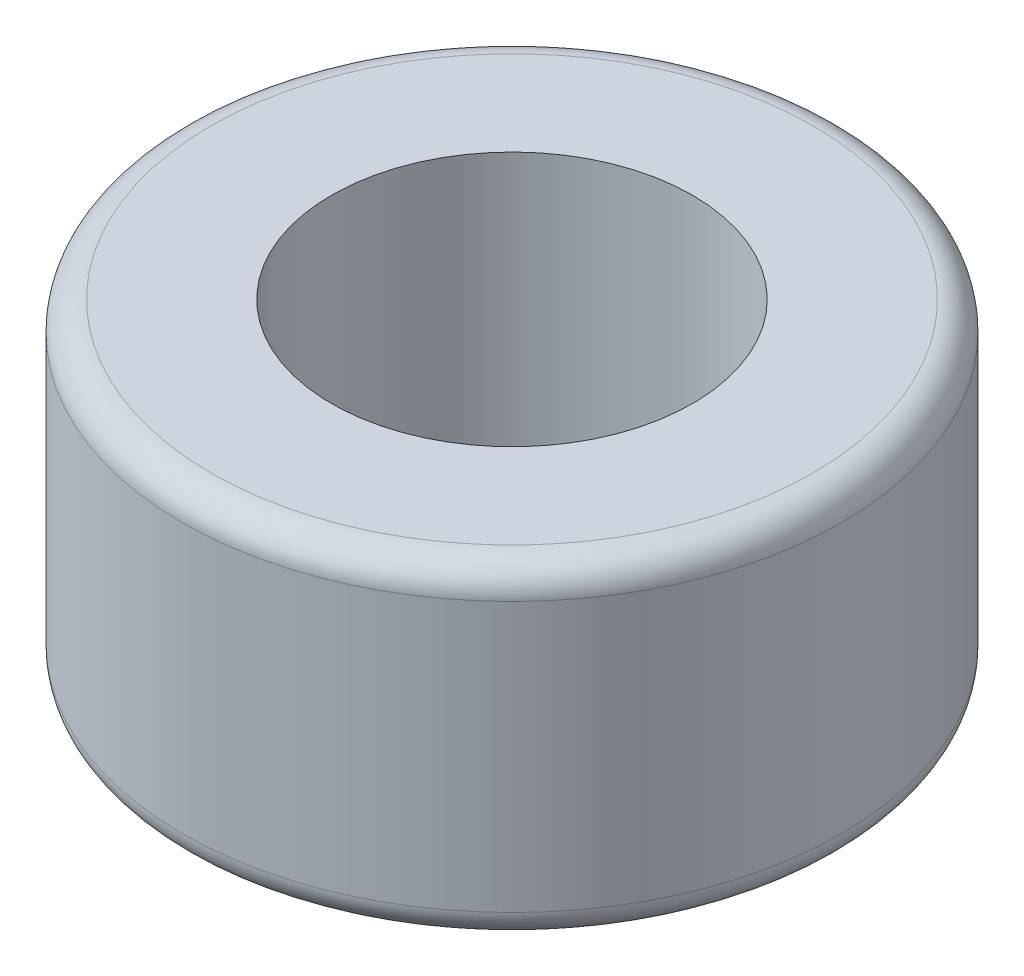
ISO-10303-21;
HEADER;
FILE_DESCRIPTION(('STEP AP214'),'2;1');
FILE_NAME('part.step','',(''),(''),'','','');
FILE_SCHEMA(('AUTOMOTIVE_DESIGN { 1 0 10303 214 1 1 1 1 }'));
ENDSEC;
DATA;
#1=APPLICATION_CONTEXT('core data for automotive mechanical design processes');
#2=APPLICATION_PROTOCOL_DEFINITION('international standard','automotive_design',2000,#1);
#3=PRODUCT_CONTEXT('',#1,'mechanical');
#4=PRODUCT('Part','Part','',(#3));
#5=PRODUCT_RELATED_PRODUCT_CATEGORY('part','',(#4));
#6=PRODUCT_DEFINITION_FORMATION('','',#4);
#7=PRODUCT_DEFINITION_CONTEXT('part definition',#1,'design');
#8=PRODUCT_DEFINITION('design','',#6,#7);
#9=PRODUCT_DEFINITION_SHAPE('','',#8);
#10=(LENGTH_UNIT() NAMED_UNIT(*) SI_UNIT(.MILLI.,.METRE.));
#11=(NAMED_UNIT(*) PLANE_ANGLE_UNIT() SI_UNIT($,.RADIAN.));
#12=(NAMED_UNIT(*) SI_UNIT($,.STERADIAN.) SOLID_ANGLE_UNIT());
#13=UNCERTAINTY_MEASURE_WITH_UNIT(LENGTH_MEASURE(1.E-05),#10,'distance_accuracy_value','');
#14=(GEOMETRIC_REPRESENTATION_CONTEXT(3) GLOBAL_UNCERTAINTY_ASSIGNED_CONTEXT((#13)) GLOBAL_UNIT_ASSIGNED_CONTEXT((#10,
#11,#12)) REPRESENTATION_CONTEXT('',''));
#15=CARTESIAN_POINT('',(0.,0.,0.));
#16=DIRECTION('',(0.,0.,1.));
#17=DIRECTION('',(1.,0.,0.));
#18=AXIS2_PLACEMENT_3D('',#15,#16,#17);
#19=CARTESIAN_POINT('',(0.,0.,0.));
#20=DIRECTION('',(0.,-1.,0.));
#21=DIRECTION('',(0.,0.,-1.));
#22=AXIS2_PLACEMENT_3D('',#19,#20,#21);
#23=CYLINDRICAL_SURFACE('',#22,5.75);
#24=CARTESIAN_POINT('',(0.,-2.35,0.));
#25=DIRECTION('',(0.,1.,0.));
#26=DIRECTION('',(0.,0.,1.));
#27=AXIS2_PLACEMENT_3D('',#24,#25,#26);
#28=CIRCLE('',#27,5.75);
#29=CARTESIAN_POINT('',(0.,-2.35,5.75));
#30=VERTEX_POINT('',#29);
#31=EDGE_CURVE('E37',#30,#30,#28,.T.);
#32=ORIENTED_EDGE('',*,*,#31,.T.);
#33=EDGE_LOOP('',(#32));
#34=FACE_BOUND('',#33,.T.);
#35=CARTESIAN_POINT('',(0.,2.35,0.));
#36=DIRECTION('',(0.,-1.,0.));
#37=DIRECTION('',(0.,0.,-1.));
#38=AXIS2_PLACEMENT_3D('',#35,#36,#37);
#39=CIRCLE('',#38,5.75);
#40=CARTESIAN_POINT('',(0.,2.35,-5.75));
#41=VERTEX_POINT('',#40);
#42=EDGE_CURVE('E41',#41,#41,#39,.T.);
#43=ORIENTED_EDGE('',*,*,#42,.T.);
#44=EDGE_LOOP('',(#43));
#45=FACE_BOUND('',#44,.T.);
#46=ADVANCED_FACE('F30',(#34,#45),#23,.T.);
#47=CARTESIAN_POINT('',(-5.75,-2.85,0.));
#48=DIRECTION('',(0.,1.,0.));
#49=DIRECTION('',(0.,0.,1.));
#50=AXIS2_PLACEMENT_3D('',#47,#48,#49);
#51=PLANE('',#50);
#52=CARTESIAN_POINT('',(0.,-2.85,0.));
#53=DIRECTION('',(0.,1.,0.));
#54=DIRECTION('',(0.,0.,1.));
#55=AXIS2_PLACEMENT_3D('',#52,#53,#54);
#56=CIRCLE('',#55,5.25);
#57=CARTESIAN_POINT('',(0.,-2.85,5.25));
#58=VERTEX_POINT('',#57);
#59=EDGE_CURVE('E45',#58,#58,#56,.F.);
#60=ORIENTED_EDGE('',*,*,#59,.T.);
#61=EDGE_LOOP('',(#60));
#62=FACE_BOUND('',#61,.T.);
#63=CARTESIAN_POINT('',(0.,-2.85,0.));
#64=DIRECTION('',(0.,-1.,0.));
#65=DIRECTION('',(0.,0.,-1.));
#66=AXIS2_PLACEMENT_3D('',#63,#64,#65);
#67=CIRCLE('',#66,3.15);
#68=CARTESIAN_POINT('',(0.,-2.85,-3.15));
#69=VERTEX_POINT('',#68);
#70=EDGE_CURVE('E50',#69,#69,#67,.T.);
#71=ORIENTED_EDGE('',*,*,#70,.F.);
#72=EDGE_LOOP('',(#71));
#73=FACE_BOUND('',#72,.T.);
#74=ADVANCED_FACE('F62',(#62,#73),#51,.F.);
#75=CARTESIAN_POINT('',(0.,0.,0.));
#76=DIRECTION('',(0.,-1.,0.));
#77=DIRECTION('',(0.,0.,-1.));
#78=AXIS2_PLACEMENT_3D('',#75,#76,#77);
#79=CYLINDRICAL_SURFACE('',#78,3.15);
#80=CARTESIAN_POINT('',(0.,2.85,0.));
#81=DIRECTION('',(0.,-1.,0.));
#82=DIRECTION('',(0.,0.,-1.));
#83=AXIS2_PLACEMENT_3D('',#80,#81,#82);
#84=CIRCLE('',#83,3.15);
#85=CARTESIAN_POINT('',(0.,2.85,-3.15));
#86=VERTEX_POINT('',#85);
#87=EDGE_CURVE('E53',#86,#86,#84,.T.);
#88=ORIENTED_EDGE('',*,*,#87,.F.);
#89=EDGE_LOOP('',(#88));
#90=FACE_BOUND('',#89,.T.);
#91=ORIENTED_EDGE('',*,*,#70,.T.);
#92=EDGE_LOOP('',(#91));
#93=FACE_BOUND('',#92,.T.);
#94=ADVANCED_FACE('F59',(#90,#93),#79,.F.);
#95=CARTESIAN_POINT('',(-5.75,2.85,0.));
#96=DIRECTION('',(0.,-1.,0.));
#97=DIRECTION('',(0.,0.,-1.));
#98=AXIS2_PLACEMENT_3D('',#95,#96,#97);
#99=PLANE('',#98);
#100=CARTESIAN_POINT('',(0.,2.85,0.));
#101=DIRECTION('',(0.,-1.,0.));
#102=DIRECTION('',(0.,0.,-1.));
#103=AXIS2_PLACEMENT_3D('',#100,#101,#102);
#104=CIRCLE('',#103,5.25);
#105=CARTESIAN_POINT('',(0.,2.85,-5.25));
#106=VERTEX_POINT('',#105);
#107=EDGE_CURVE('E10',#106,#106,#104,.F.);
#108=ORIENTED_EDGE('',*,*,#107,.T.);
#109=EDGE_LOOP('',(#108));
#110=FACE_BOUND('',#109,.T.);
#111=ORIENTED_EDGE('',*,*,#87,.T.);
#112=EDGE_LOOP('',(#111));
#113=FACE_BOUND('',#112,.T.);
#114=ADVANCED_FACE('F57',(#110,#113),#99,.F.);
#115=CARTESIAN_POINT('',(0.,-2.35,0.));
#116=DIRECTION('',(0.,1.,0.));
#117=DIRECTION('',(0.,0.,1.));
#118=AXIS2_PLACEMENT_3D('',#115,#116,#117);
#119=TOROIDAL_SURFACE('',#118,5.25,0.5);
#120=ORIENTED_EDGE('',*,*,#31,.F.);
#121=EDGE_LOOP('',(#120));
#122=FACE_BOUND('',#121,.T.);
#123=ORIENTED_EDGE('',*,*,#59,.F.);
#124=EDGE_LOOP('',(#123));
#125=FACE_BOUND('',#124,.T.);
#126=ADVANCED_FACE('F74',(#122,#125),#119,.T.);
#127=CARTESIAN_POINT('',(0.,2.35,0.));
#128=DIRECTION('',(0.,-1.,0.));
#129=DIRECTION('',(0.,0.,-1.));
#130=AXIS2_PLACEMENT_3D('',#127,#128,#129);
#131=TOROIDAL_SURFACE('',#130,5.25,0.5);
#132=ORIENTED_EDGE('',*,*,#107,.F.);
#133=EDGE_LOOP('',(#132));
#134=FACE_BOUND('',#133,.T.);
#135=ORIENTED_EDGE('',*,*,#42,.F.);
#136=EDGE_LOOP('',(#135));
#137=FACE_BOUND('',#136,.T.);
#138=ADVANCED_FACE('F32',(#134,#137),#131,.T.);
#139=CLOSED_SHELL('',(#46,#74,#94,#114,#126,#138));
#140=MANIFOLD_SOLID_BREP('B2',#139);
#141=ADVANCED_BREP_SHAPE_REPRESENTATION('',(#18,#140),#14);
#142=SHAPE_DEFINITION_REPRESENTATION(#9,#141);
ENDSEC;
END-ISO-10303-21;
